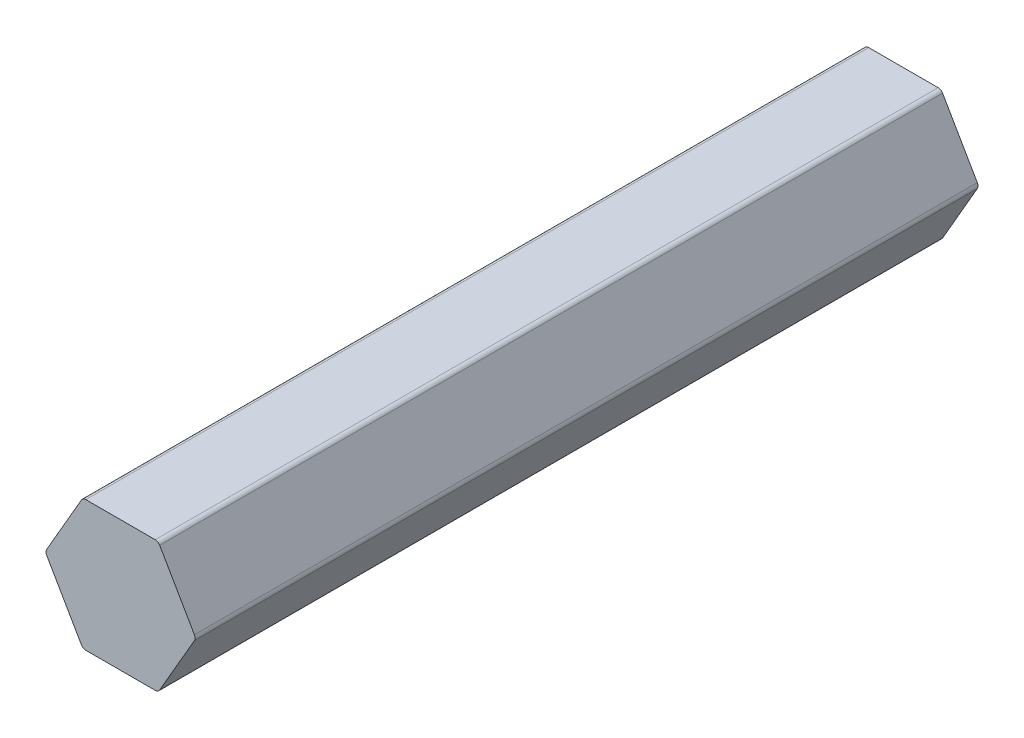
ISO-10303-21;
HEADER;
FILE_DESCRIPTION(('STEP AP214'),'2;1');
FILE_NAME('part.step','',(''),(''),'','','');
FILE_SCHEMA(('AUTOMOTIVE_DESIGN { 1 0 10303 214 1 1 1 1 }'));
ENDSEC;
DATA;
#1=APPLICATION_CONTEXT('core data for automotive mechanical design processes');
#2=APPLICATION_PROTOCOL_DEFINITION('international standard','automotive_design',2000,#1);
#3=PRODUCT_CONTEXT('',#1,'mechanical');
#4=PRODUCT('Part','Part','',(#3));
#5=PRODUCT_RELATED_PRODUCT_CATEGORY('part','',(#4));
#6=PRODUCT_DEFINITION_FORMATION('','',#4);
#7=PRODUCT_DEFINITION_CONTEXT('part definition',#1,'design');
#8=PRODUCT_DEFINITION('design','',#6,#7);
#9=PRODUCT_DEFINITION_SHAPE('','',#8);
#10=(LENGTH_UNIT() NAMED_UNIT(*) SI_UNIT(.MILLI.,.METRE.));
#11=(NAMED_UNIT(*) PLANE_ANGLE_UNIT() SI_UNIT($,.RADIAN.));
#12=(NAMED_UNIT(*) SI_UNIT($,.STERADIAN.) SOLID_ANGLE_UNIT());
#13=UNCERTAINTY_MEASURE_WITH_UNIT(LENGTH_MEASURE(1.E-05),#10,'distance_accuracy_value','');
#14=(GEOMETRIC_REPRESENTATION_CONTEXT(3) GLOBAL_UNCERTAINTY_ASSIGNED_CONTEXT((#13)) GLOBAL_UNIT_ASSIGNED_CONTEXT((#10,
#11,#12)) REPRESENTATION_CONTEXT('',''));
#15=CARTESIAN_POINT('',(0.,0.,0.));
#16=DIRECTION('',(0.,0.,1.));
#17=DIRECTION('',(1.,0.,0.));
#18=AXIS2_PLACEMENT_3D('',#15,#16,#17);
#19=CARTESIAN_POINT('',(3.66617420935413,-6.35,38.1));
#20=DIRECTION('',(-0.866025403784439,0.5,0.));
#21=DIRECTION('',(-0.5,-0.866025403784439,0.));
#22=AXIS2_PLACEMENT_3D('',#19,#20,#21);
#23=PLANE('',#22);
#24=DIRECTION('',(0.5,0.866025403784439,0.));
#25=VECTOR('',#24,1.);
#26=CARTESIAN_POINT('',(3.66617420935413,-6.35,38.1));
#27=LINE('',#26,#25);
#28=CARTESIAN_POINT('',(3.81051177665154,-6.1,38.1));
#29=VERTEX_POINT('',#28);
#30=CARTESIAN_POINT('',(7.18801085141085,-0.249999999999999,38.1));
#31=VERTEX_POINT('',#30);
#32=EDGE_CURVE('E151',#29,#31,#27,.T.);
#33=ORIENTED_EDGE('',*,*,#32,.F.);
#34=DIRECTION('',(0.,0.,-1.));
#35=VECTOR('',#34,1.);
#36=CARTESIAN_POINT('',(3.81051177665154,-6.1,38.1));
#37=LINE('',#36,#35);
#38=CARTESIAN_POINT('',(3.81051177665154,-6.1,-38.1));
#39=VERTEX_POINT('',#38);
#40=EDGE_CURVE('E135',#29,#39,#37,.T.);
#41=ORIENTED_EDGE('',*,*,#40,.T.);
#42=DIRECTION('',(0.5,0.866025403784439,0.));
#43=VECTOR('',#42,1.);
#44=CARTESIAN_POINT('',(3.66617420935413,-6.35,-38.1));
#45=LINE('',#44,#43);
#46=CARTESIAN_POINT('',(7.18801085141085,-0.249999999999999,-38.1));
#47=VERTEX_POINT('',#46);
#48=EDGE_CURVE('E148',#39,#47,#45,.T.);
#49=ORIENTED_EDGE('',*,*,#48,.T.);
#50=DIRECTION('',(0.,0.,-1.));
#51=VECTOR('',#50,1.);
#52=CARTESIAN_POINT('',(7.18801085141085,-0.249999999999999,38.1));
#53=LINE('',#52,#51);
#54=EDGE_CURVE('E154',#47,#31,#53,.F.);
#55=ORIENTED_EDGE('',*,*,#54,.T.);
#56=EDGE_LOOP('',(#33,#41,#49,#55));
#57=FACE_BOUND('',#56,.T.);
#58=ADVANCED_FACE('F39',(#57),#23,.F.);
#59=CARTESIAN_POINT('',(7.33234841870826,0.,38.1));
#60=DIRECTION('',(-0.866025403784438,-0.5,0.));
#61=DIRECTION('',(0.5,-0.866025403784438,0.));
#62=AXIS2_PLACEMENT_3D('',#59,#60,#61);
#63=PLANE('',#62);
#64=DIRECTION('',(-0.5,0.866025403784438,0.));
#65=VECTOR('',#64,1.);
#66=CARTESIAN_POINT('',(7.33234841870826,0.,38.1));
#67=LINE('',#66,#65);
#68=CARTESIAN_POINT('',(7.18801085141085,0.25,38.1));
#69=VERTEX_POINT('',#68);
#70=CARTESIAN_POINT('',(3.81051177665153,6.10000000000001,38.1));
#71=VERTEX_POINT('',#70);
#72=EDGE_CURVE('E244',#69,#71,#67,.T.);
#73=ORIENTED_EDGE('',*,*,#72,.F.);
#74=DIRECTION('',(0.,0.,-1.));
#75=VECTOR('',#74,1.);
#76=CARTESIAN_POINT('',(7.18801085141085,0.25,38.1));
#77=LINE('',#76,#75);
#78=CARTESIAN_POINT('',(7.18801085141085,0.25,-38.1));
#79=VERTEX_POINT('',#78);
#80=EDGE_CURVE('E11',#69,#79,#77,.T.);
#81=ORIENTED_EDGE('',*,*,#80,.T.);
#82=DIRECTION('',(-0.5,0.866025403784438,0.));
#83=VECTOR('',#82,1.);
#84=CARTESIAN_POINT('',(7.33234841870826,0.,-38.1));
#85=LINE('',#84,#83);
#86=CARTESIAN_POINT('',(3.81051177665153,6.10000000000001,-38.1));
#87=VERTEX_POINT('',#86);
#88=EDGE_CURVE('E160',#79,#87,#85,.T.);
#89=ORIENTED_EDGE('',*,*,#88,.T.);
#90=DIRECTION('',(0.,0.,-1.));
#91=VECTOR('',#90,1.);
#92=CARTESIAN_POINT('',(3.81051177665153,6.10000000000001,38.1));
#93=LINE('',#92,#91);
#94=EDGE_CURVE('E48',#87,#71,#93,.F.);
#95=ORIENTED_EDGE('',*,*,#94,.T.);
#96=EDGE_LOOP('',(#73,#81,#89,#95));
#97=FACE_BOUND('',#96,.T.);
#98=ADVANCED_FACE('F243',(#97),#63,.F.);
#99=CARTESIAN_POINT('',(3.66617420935412,6.35000000000001,38.1));
#100=DIRECTION('',(0.,-1.,0.));
#101=DIRECTION('',(1.,0.,0.));
#102=AXIS2_PLACEMENT_3D('',#99,#100,#101);
#103=PLANE('',#102);
#104=DIRECTION('',(-1.,0.,0.));
#105=VECTOR('',#104,1.);
#106=CARTESIAN_POINT('',(3.66617420935412,6.35000000000001,-38.1));
#107=LINE('',#106,#105);
#108=CARTESIAN_POINT('',(3.37749907475931,6.35000000000001,-38.1));
#109=VERTEX_POINT('',#108);
#110=CARTESIAN_POINT('',(-3.37749907475931,6.35,-38.1));
#111=VERTEX_POINT('',#110);
#112=EDGE_CURVE('E164',#109,#111,#107,.T.);
#113=ORIENTED_EDGE('',*,*,#112,.T.);
#114=DIRECTION('',(0.,0.,-1.));
#115=VECTOR('',#114,1.);
#116=CARTESIAN_POINT('',(-3.37749907475932,6.35,38.1));
#117=LINE('',#116,#115);
#118=CARTESIAN_POINT('',(-3.37749907475931,6.35,38.1));
#119=VERTEX_POINT('',#118);
#120=EDGE_CURVE('E236',#111,#119,#117,.F.);
#121=ORIENTED_EDGE('',*,*,#120,.T.);
#122=DIRECTION('',(-1.,0.,0.));
#123=VECTOR('',#122,1.);
#124=CARTESIAN_POINT('',(3.66617420935412,6.35000000000001,38.1));
#125=LINE('',#124,#123);
#126=CARTESIAN_POINT('',(3.37749907475931,6.35000000000001,38.1));
#127=VERTEX_POINT('',#126);
#128=EDGE_CURVE('E254',#127,#119,#125,.T.);
#129=ORIENTED_EDGE('',*,*,#128,.F.);
#130=DIRECTION('',(0.,0.,-1.));
#131=VECTOR('',#130,1.);
#132=CARTESIAN_POINT('',(3.37749907475931,6.35000000000001,38.1));
#133=LINE('',#132,#131);
#134=EDGE_CURVE('E232',#127,#109,#133,.T.);
#135=ORIENTED_EDGE('',*,*,#134,.T.);
#136=EDGE_LOOP('',(#113,#121,#129,#135));
#137=FACE_BOUND('',#136,.T.);
#138=ADVANCED_FACE('F259',(#137),#103,.F.);
#139=CARTESIAN_POINT('',(-3.66617420935413,6.35,38.1));
#140=DIRECTION('',(0.866025403784439,-0.5,0.));
#141=DIRECTION('',(0.5,0.866025403784439,0.));
#142=AXIS2_PLACEMENT_3D('',#139,#140,#141);
#143=PLANE('',#142);
#144=DIRECTION('',(-0.5,-0.866025403784439,0.));
#145=VECTOR('',#144,1.);
#146=CARTESIAN_POINT('',(-3.66617420935413,6.35,-38.1));
#147=LINE('',#146,#145);
#148=CARTESIAN_POINT('',(-3.81051177665154,6.1,-38.1));
#149=VERTEX_POINT('',#148);
#150=CARTESIAN_POINT('',(-7.18801085141085,0.249999999999999,-38.1));
#151=VERTEX_POINT('',#150);
#152=EDGE_CURVE('E173',#149,#151,#147,.T.);
#153=ORIENTED_EDGE('',*,*,#152,.T.);
#154=DIRECTION('',(0.,0.,-1.));
#155=VECTOR('',#154,1.);
#156=CARTESIAN_POINT('',(-7.18801085141085,0.250000000000001,38.1));
#157=LINE('',#156,#155);
#158=CARTESIAN_POINT('',(-7.18801085141085,0.249999999999999,38.1));
#159=VERTEX_POINT('',#158);
#160=EDGE_CURVE('E229',#151,#159,#157,.F.);
#161=ORIENTED_EDGE('',*,*,#160,.T.);
#162=DIRECTION('',(-0.5,-0.866025403784439,0.));
#163=VECTOR('',#162,1.);
#164=CARTESIAN_POINT('',(-3.66617420935413,6.35,38.1));
#165=LINE('',#164,#163);
#166=CARTESIAN_POINT('',(-3.81051177665154,6.1,38.1));
#167=VERTEX_POINT('',#166);
#168=EDGE_CURVE('E270',#167,#159,#165,.T.);
#169=ORIENTED_EDGE('',*,*,#168,.F.);
#170=DIRECTION('',(0.,0.,-1.));
#171=VECTOR('',#170,1.);
#172=CARTESIAN_POINT('',(-3.81051177665154,6.1,38.1));
#173=LINE('',#172,#171);
#174=EDGE_CURVE('E225',#167,#149,#173,.T.);
#175=ORIENTED_EDGE('',*,*,#174,.T.);
#176=EDGE_LOOP('',(#153,#161,#169,#175));
#177=FACE_BOUND('',#176,.T.);
#178=ADVANCED_FACE('F268',(#177),#143,.F.);
#179=CARTESIAN_POINT('',(-7.33234841870825,0.,38.1));
#180=DIRECTION('',(0.866025403784438,0.500000000000001,0.));
#181=DIRECTION('',(-0.500000000000001,0.866025403784438,0.));
#182=AXIS2_PLACEMENT_3D('',#179,#180,#181);
#183=PLANE('',#182);
#184=DIRECTION('',(0.5,-0.866025403784438,0.));
#185=VECTOR('',#184,1.);
#186=CARTESIAN_POINT('',(-7.33234841870825,0.,-38.1));
#187=LINE('',#186,#185);
#188=CARTESIAN_POINT('',(-7.18801085141085,-0.249999999999999,-38.1));
#189=VERTEX_POINT('',#188);
#190=CARTESIAN_POINT('',(-3.81051177665153,-6.10000000000001,-38.1));
#191=VERTEX_POINT('',#190);
#192=EDGE_CURVE('E177',#189,#191,#187,.T.);
#193=ORIENTED_EDGE('',*,*,#192,.T.);
#194=DIRECTION('',(0.,0.,-1.));
#195=VECTOR('',#194,1.);
#196=CARTESIAN_POINT('',(-3.81051177665153,-6.10000000000001,38.1));
#197=LINE('',#196,#195);
#198=CARTESIAN_POINT('',(-3.81051177665153,-6.10000000000001,38.1));
#199=VERTEX_POINT('',#198);
#200=EDGE_CURVE('E55',#191,#199,#197,.F.);
#201=ORIENTED_EDGE('',*,*,#200,.T.);
#202=DIRECTION('',(0.5,-0.866025403784438,0.));
#203=VECTOR('',#202,1.);
#204=CARTESIAN_POINT('',(-7.33234841870825,0.,38.1));
#205=LINE('',#204,#203);
#206=CARTESIAN_POINT('',(-7.18801085141085,-0.249999999999999,38.1));
#207=VERTEX_POINT('',#206);
#208=EDGE_CURVE('E272',#207,#199,#205,.T.);
#209=ORIENTED_EDGE('',*,*,#208,.F.);
#210=DIRECTION('',(0.,0.,-1.));
#211=VECTOR('',#210,1.);
#212=CARTESIAN_POINT('',(-7.18801085141085,-0.249999999999999,38.1));
#213=LINE('',#212,#211);
#214=EDGE_CURVE('E219',#207,#189,#213,.T.);
#215=ORIENTED_EDGE('',*,*,#214,.T.);
#216=EDGE_LOOP('',(#193,#201,#209,#215));
#217=FACE_BOUND('',#216,.T.);
#218=ADVANCED_FACE('F308',(#217),#183,.F.);
#219=CARTESIAN_POINT('',(-3.66617420935412,-6.35,38.1));
#220=DIRECTION('',(0.,1.,0.));
#221=DIRECTION('',(-1.,0.,0.));
#222=AXIS2_PLACEMENT_3D('',#219,#220,#221);
#223=PLANE('',#222);
#224=DIRECTION('',(1.,0.,0.));
#225=VECTOR('',#224,1.);
#226=CARTESIAN_POINT('',(-3.66617420935412,-6.35,-38.1));
#227=LINE('',#226,#225);
#228=CARTESIAN_POINT('',(-3.37749907475931,-6.35,-38.1));
#229=VERTEX_POINT('',#228);
#230=CARTESIAN_POINT('',(3.37749907475932,-6.35,-38.1));
#231=VERTEX_POINT('',#230);
#232=EDGE_CURVE('E180',#229,#231,#227,.T.);
#233=ORIENTED_EDGE('',*,*,#232,.T.);
#234=DIRECTION('',(0.,0.,-1.));
#235=VECTOR('',#234,1.);
#236=CARTESIAN_POINT('',(3.37749907475932,-6.35,38.1));
#237=LINE('',#236,#235);
#238=CARTESIAN_POINT('',(3.37749907475932,-6.35,38.1));
#239=VERTEX_POINT('',#238);
#240=EDGE_CURVE('E136',#231,#239,#237,.F.);
#241=ORIENTED_EDGE('',*,*,#240,.T.);
#242=DIRECTION('',(1.,0.,0.));
#243=VECTOR('',#242,1.);
#244=CARTESIAN_POINT('',(-3.66617420935412,-6.35,38.1));
#245=LINE('',#244,#243);
#246=CARTESIAN_POINT('',(-3.37749907475931,-6.35,38.1));
#247=VERTEX_POINT('',#246);
#248=EDGE_CURVE('E167',#247,#239,#245,.T.);
#249=ORIENTED_EDGE('',*,*,#248,.F.);
#250=DIRECTION('',(0.,0.,-1.));
#251=VECTOR('',#250,1.);
#252=CARTESIAN_POINT('',(-3.37749907475931,-6.35,38.1));
#253=LINE('',#252,#251);
#254=EDGE_CURVE('E142',#247,#229,#253,.T.);
#255=ORIENTED_EDGE('',*,*,#254,.T.);
#256=EDGE_LOOP('',(#233,#241,#249,#255));
#257=FACE_BOUND('',#256,.T.);
#258=ADVANCED_FACE('F313',(#257),#223,.F.);
#259=CARTESIAN_POINT('',(0.,0.,38.1));
#260=DIRECTION('',(0.,0.,1.));
#261=DIRECTION('',(1.,0.,0.));
#262=AXIS2_PLACEMENT_3D('',#259,#260,#261);
#263=PLANE('',#262);
#264=ORIENTED_EDGE('',*,*,#248,.T.);
#265=CARTESIAN_POINT('',(3.37749907475932,-5.85,38.1));
#266=DIRECTION('',(0.,0.,1.));
#267=DIRECTION('',(1.,0.,0.));
#268=AXIS2_PLACEMENT_3D('',#265,#266,#267);
#269=CIRCLE('',#268,0.5);
#270=EDGE_CURVE('E216',#239,#29,#269,.T.);
#271=ORIENTED_EDGE('',*,*,#270,.T.);
#272=ORIENTED_EDGE('',*,*,#32,.T.);
#273=CARTESIAN_POINT('',(6.75499814951863,0.,38.1));
#274=DIRECTION('',(0.,0.,1.));
#275=DIRECTION('',(1.,0.,0.));
#276=AXIS2_PLACEMENT_3D('',#273,#274,#275);
#277=CIRCLE('',#276,0.5);
#278=EDGE_CURVE('E205',#31,#69,#277,.T.);
#279=ORIENTED_EDGE('',*,*,#278,.T.);
#280=ORIENTED_EDGE('',*,*,#72,.T.);
#281=CARTESIAN_POINT('',(3.37749907475931,5.85000000000001,38.1));
#282=DIRECTION('',(0.,0.,1.));
#283=DIRECTION('',(1.,0.,0.));
#284=AXIS2_PLACEMENT_3D('',#281,#282,#283);
#285=CIRCLE('',#284,0.5);
#286=EDGE_CURVE('E202',#71,#127,#285,.T.);
#287=ORIENTED_EDGE('',*,*,#286,.T.);
#288=ORIENTED_EDGE('',*,*,#128,.T.);
#289=CARTESIAN_POINT('',(-3.37749907475932,5.85,38.1));
#290=DIRECTION('',(0.,0.,1.));
#291=DIRECTION('',(1.,0.,0.));
#292=AXIS2_PLACEMENT_3D('',#289,#290,#291);
#293=CIRCLE('',#292,0.5);
#294=EDGE_CURVE('E208',#119,#167,#293,.T.);
#295=ORIENTED_EDGE('',*,*,#294,.T.);
#296=ORIENTED_EDGE('',*,*,#168,.T.);
#297=CARTESIAN_POINT('',(-6.75499814951863,0.,38.1));
#298=DIRECTION('',(0.,0.,1.));
#299=DIRECTION('',(1.,0.,0.));
#300=AXIS2_PLACEMENT_3D('',#297,#298,#299);
#301=CIRCLE('',#300,0.5);
#302=EDGE_CURVE('E62',#159,#207,#301,.T.);
#303=ORIENTED_EDGE('',*,*,#302,.T.);
#304=ORIENTED_EDGE('',*,*,#208,.T.);
#305=CARTESIAN_POINT('',(-3.37749907475931,-5.85,38.1));
#306=DIRECTION('',(0.,0.,1.));
#307=DIRECTION('',(1.,0.,0.));
#308=AXIS2_PLACEMENT_3D('',#305,#306,#307);
#309=CIRCLE('',#308,0.5);
#310=EDGE_CURVE('E213',#199,#247,#309,.T.);
#311=ORIENTED_EDGE('',*,*,#310,.T.);
#312=EDGE_LOOP('',(#264,#271,#272,#279,#280,#287,#288,#295,#296,#303,#304,#311));
#313=FACE_BOUND('',#312,.T.);
#314=ADVANCED_FACE('F249',(#313),#263,.T.);
#315=CARTESIAN_POINT('',(0.,0.,-38.1));
#316=DIRECTION('',(0.,0.,1.));
#317=DIRECTION('',(1.,0.,0.));
#318=AXIS2_PLACEMENT_3D('',#315,#316,#317);
#319=PLANE('',#318);
#320=ORIENTED_EDGE('',*,*,#48,.F.);
#321=CARTESIAN_POINT('',(3.37749907475932,-5.85,-38.1));
#322=DIRECTION('',(0.,0.,1.));
#323=DIRECTION('',(1.,0.,0.));
#324=AXIS2_PLACEMENT_3D('',#321,#322,#323);
#325=CIRCLE('',#324,0.5);
#326=EDGE_CURVE('E131',#39,#231,#325,.F.);
#327=ORIENTED_EDGE('',*,*,#326,.T.);
#328=ORIENTED_EDGE('',*,*,#232,.F.);
#329=CARTESIAN_POINT('',(-3.37749907475931,-5.85,-38.1));
#330=DIRECTION('',(0.,0.,1.));
#331=DIRECTION('',(1.,0.,0.));
#332=AXIS2_PLACEMENT_3D('',#329,#330,#331);
#333=CIRCLE('',#332,0.5);
#334=EDGE_CURVE('E143',#229,#191,#333,.F.);
#335=ORIENTED_EDGE('',*,*,#334,.T.);
#336=ORIENTED_EDGE('',*,*,#192,.F.);
#337=CARTESIAN_POINT('',(-6.75499814951863,0.,-38.1));
#338=DIRECTION('',(0.,0.,1.));
#339=DIRECTION('',(1.,0.,0.));
#340=AXIS2_PLACEMENT_3D('',#337,#338,#339);
#341=CIRCLE('',#340,0.5);
#342=EDGE_CURVE('E192',#189,#151,#341,.F.);
#343=ORIENTED_EDGE('',*,*,#342,.T.);
#344=ORIENTED_EDGE('',*,*,#152,.F.);
#345=CARTESIAN_POINT('',(-3.37749907475932,5.85,-38.1));
#346=DIRECTION('',(0.,0.,1.));
#347=DIRECTION('',(1.,0.,0.));
#348=AXIS2_PLACEMENT_3D('',#345,#346,#347);
#349=CIRCLE('',#348,0.5);
#350=EDGE_CURVE('E189',#149,#111,#349,.F.);
#351=ORIENTED_EDGE('',*,*,#350,.T.);
#352=ORIENTED_EDGE('',*,*,#112,.F.);
#353=CARTESIAN_POINT('',(3.37749907475931,5.85000000000001,-38.1));
#354=DIRECTION('',(0.,0.,1.));
#355=DIRECTION('',(1.,0.,0.));
#356=AXIS2_PLACEMENT_3D('',#353,#354,#355);
#357=CIRCLE('',#356,0.5);
#358=EDGE_CURVE('E153',#109,#87,#357,.F.);
#359=ORIENTED_EDGE('',*,*,#358,.T.);
#360=ORIENTED_EDGE('',*,*,#88,.F.);
#361=CARTESIAN_POINT('',(6.75499814951863,0.,-38.1));
#362=DIRECTION('',(0.,0.,1.));
#363=DIRECTION('',(1.,0.,0.));
#364=AXIS2_PLACEMENT_3D('',#361,#362,#363);
#365=CIRCLE('',#364,0.5);
#366=EDGE_CURVE('E158',#79,#47,#365,.F.);
#367=ORIENTED_EDGE('',*,*,#366,.T.);
#368=EDGE_LOOP('',(#320,#327,#328,#335,#336,#343,#344,#351,#352,#359,#360,#367));
#369=FACE_BOUND('',#368,.T.);
#370=ADVANCED_FACE('F156',(#369),#319,.F.);
#371=CARTESIAN_POINT('',(3.37749907475932,-5.85,38.1));
#372=DIRECTION('',(0.,0.,-1.));
#373=DIRECTION('',(-1.,0.,0.));
#374=AXIS2_PLACEMENT_3D('',#371,#372,#373);
#375=CYLINDRICAL_SURFACE('',#374,0.5);
#376=ORIENTED_EDGE('',*,*,#270,.F.);
#377=ORIENTED_EDGE('',*,*,#240,.F.);
#378=ORIENTED_EDGE('',*,*,#326,.F.);
#379=ORIENTED_EDGE('',*,*,#40,.F.);
#380=EDGE_LOOP('',(#376,#377,#378,#379));
#381=FACE_BOUND('',#380,.T.);
#382=ADVANCED_FACE('F134',(#381),#375,.T.);
#383=CARTESIAN_POINT('',(-3.37749907475931,-5.85,38.1));
#384=DIRECTION('',(0.,0.,-1.));
#385=DIRECTION('',(-1.,0.,0.));
#386=AXIS2_PLACEMENT_3D('',#383,#384,#385);
#387=CYLINDRICAL_SURFACE('',#386,0.5);
#388=ORIENTED_EDGE('',*,*,#310,.F.);
#389=ORIENTED_EDGE('',*,*,#200,.F.);
#390=ORIENTED_EDGE('',*,*,#334,.F.);
#391=ORIENTED_EDGE('',*,*,#254,.F.);
#392=EDGE_LOOP('',(#388,#389,#390,#391));
#393=FACE_BOUND('',#392,.T.);
#394=ADVANCED_FACE('F298',(#393),#387,.T.);
#395=CARTESIAN_POINT('',(-6.75499814951863,0.,38.1));
#396=DIRECTION('',(0.,0.,-1.));
#397=DIRECTION('',(-1.,0.,0.));
#398=AXIS2_PLACEMENT_3D('',#395,#396,#397);
#399=CYLINDRICAL_SURFACE('',#398,0.5);
#400=ORIENTED_EDGE('',*,*,#302,.F.);
#401=ORIENTED_EDGE('',*,*,#160,.F.);
#402=ORIENTED_EDGE('',*,*,#342,.F.);
#403=ORIENTED_EDGE('',*,*,#214,.F.);
#404=EDGE_LOOP('',(#400,#401,#402,#403));
#405=FACE_BOUND('',#404,.T.);
#406=ADVANCED_FACE('F286',(#405),#399,.T.);
#407=CARTESIAN_POINT('',(-3.37749907475932,5.85,38.1));
#408=DIRECTION('',(0.,0.,-1.));
#409=DIRECTION('',(-1.,0.,0.));
#410=AXIS2_PLACEMENT_3D('',#407,#408,#409);
#411=CYLINDRICAL_SURFACE('',#410,0.5);
#412=ORIENTED_EDGE('',*,*,#294,.F.);
#413=ORIENTED_EDGE('',*,*,#120,.F.);
#414=ORIENTED_EDGE('',*,*,#350,.F.);
#415=ORIENTED_EDGE('',*,*,#174,.F.);
#416=EDGE_LOOP('',(#412,#413,#414,#415));
#417=FACE_BOUND('',#416,.T.);
#418=ADVANCED_FACE('F265',(#417),#411,.T.);
#419=CARTESIAN_POINT('',(6.75499814951863,0.,38.1));
#420=DIRECTION('',(0.,0.,-1.));
#421=DIRECTION('',(-1.,0.,0.));
#422=AXIS2_PLACEMENT_3D('',#419,#420,#421);
#423=CYLINDRICAL_SURFACE('',#422,0.5);
#424=ORIENTED_EDGE('',*,*,#278,.F.);
#425=ORIENTED_EDGE('',*,*,#54,.F.);
#426=ORIENTED_EDGE('',*,*,#366,.F.);
#427=ORIENTED_EDGE('',*,*,#80,.F.);
#428=EDGE_LOOP('',(#424,#425,#426,#427));
#429=FACE_BOUND('',#428,.T.);
#430=ADVANCED_FACE('F280',(#429),#423,.T.);
#431=CARTESIAN_POINT('',(3.37749907475931,5.85000000000001,38.1));
#432=DIRECTION('',(0.,0.,-1.));
#433=DIRECTION('',(-1.,0.,0.));
#434=AXIS2_PLACEMENT_3D('',#431,#432,#433);
#435=CYLINDRICAL_SURFACE('',#434,0.5);
#436=ORIENTED_EDGE('',*,*,#286,.F.);
#437=ORIENTED_EDGE('',*,*,#94,.F.);
#438=ORIENTED_EDGE('',*,*,#358,.F.);
#439=ORIENTED_EDGE('',*,*,#134,.F.);
#440=EDGE_LOOP('',(#436,#437,#438,#439));
#441=FACE_BOUND('',#440,.T.);
#442=ADVANCED_FACE('F41',(#441),#435,.T.);
#443=CLOSED_SHELL('',(#58,#98,#138,#178,#218,#258,#314,#370,#382,#394,#406,#418,#430,#442));
#444=MANIFOLD_SOLID_BREP('B2',#443);
#445=ADVANCED_BREP_SHAPE_REPRESENTATION('',(#18,#444),#14);
#446=SHAPE_DEFINITION_REPRESENTATION(#9,#445);
ENDSEC;
END-ISO-10303-21;
